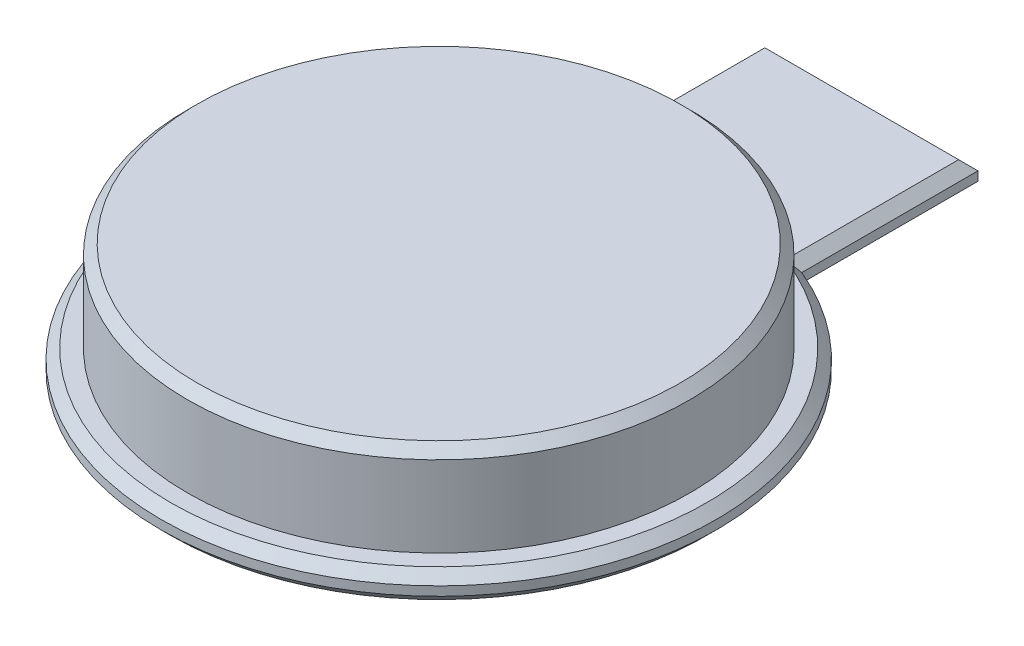
ISO-10303-21;
HEADER;
FILE_DESCRIPTION(('STEP AP214'),'2;1');
FILE_NAME('part.step','',(''),(''),'','','');
FILE_SCHEMA(('AUTOMOTIVE_DESIGN { 1 0 10303 214 1 1 1 1 }'));
ENDSEC;
DATA;
#1=APPLICATION_CONTEXT('core data for automotive mechanical design processes');
#2=APPLICATION_PROTOCOL_DEFINITION('international standard','automotive_design',2000,#1);
#3=PRODUCT_CONTEXT('',#1,'mechanical');
#4=PRODUCT('Part','Part','',(#3));
#5=PRODUCT_RELATED_PRODUCT_CATEGORY('part','',(#4));
#6=PRODUCT_DEFINITION_FORMATION('','',#4);
#7=PRODUCT_DEFINITION_CONTEXT('part definition',#1,'design');
#8=PRODUCT_DEFINITION('design','',#6,#7);
#9=PRODUCT_DEFINITION_SHAPE('','',#8);
#10=(LENGTH_UNIT() NAMED_UNIT(*) SI_UNIT(.MILLI.,.METRE.));
#11=(NAMED_UNIT(*) PLANE_ANGLE_UNIT() SI_UNIT($,.RADIAN.));
#12=(NAMED_UNIT(*) SI_UNIT($,.STERADIAN.) SOLID_ANGLE_UNIT());
#13=UNCERTAINTY_MEASURE_WITH_UNIT(LENGTH_MEASURE(1.E-05),#10,'distance_accuracy_value','');
#14=(GEOMETRIC_REPRESENTATION_CONTEXT(3) GLOBAL_UNCERTAINTY_ASSIGNED_CONTEXT((#13)) GLOBAL_UNIT_ASSIGNED_CONTEXT((#10,
#11,#12)) REPRESENTATION_CONTEXT('',''));
#15=CARTESIAN_POINT('',(0.,0.,0.));
#16=DIRECTION('',(0.,0.,1.));
#17=DIRECTION('',(1.,0.,0.));
#18=AXIS2_PLACEMENT_3D('',#15,#16,#17);
#19=CARTESIAN_POINT('',(0.,2.2,0.));
#20=DIRECTION('',(0.,-1.,0.));
#21=DIRECTION('',(0.,0.,-1.));
#22=AXIS2_PLACEMENT_3D('',#19,#20,#21);
#23=CYLINDRICAL_SURFACE('',#22,21.5);
#24=DIRECTION('',(0.,-1.,0.));
#25=VECTOR('',#24,1.);
#26=CARTESIAN_POINT('',(-8.25,2.2,-19.8541557362684));
#27=LINE('',#26,#25);
#28=CARTESIAN_POINT('',(-8.25,1.44999999999999,-19.8541557362684));
#29=VERTEX_POINT('',#28);
#30=CARTESIAN_POINT('',(-8.25,0.749999999999997,-19.8541557362684));
#31=VERTEX_POINT('',#30);
#32=EDGE_CURVE('E178',#29,#31,#27,.T.);
#33=ORIENTED_EDGE('',*,*,#32,.T.);
#34=CARTESIAN_POINT('',(0.,0.749999999999997,0.));
#35=DIRECTION('',(0.,1.,0.));
#36=DIRECTION('',(0.,0.,1.));
#37=AXIS2_PLACEMENT_3D('',#34,#35,#36);
#38=CIRCLE('',#37,21.5);
#39=CARTESIAN_POINT('',(8.25,0.749999999999997,-19.8541557362684));
#40=VERTEX_POINT('',#39);
#41=EDGE_CURVE('E213',#31,#40,#38,.T.);
#42=ORIENTED_EDGE('',*,*,#41,.T.);
#43=DIRECTION('',(0.,-1.,0.));
#44=VECTOR('',#43,1.);
#45=CARTESIAN_POINT('',(8.25,2.2,-19.8541557362684));
#46=LINE('',#45,#44);
#47=CARTESIAN_POINT('',(8.25,1.44999999999999,-19.8541557362684));
#48=VERTEX_POINT('',#47);
#49=EDGE_CURVE('E125',#48,#40,#46,.T.);
#50=ORIENTED_EDGE('',*,*,#49,.F.);
#51=CARTESIAN_POINT('',(0.,1.44999999999999,0.));
#52=DIRECTION('',(0.,1.,0.));
#53=DIRECTION('',(0.,0.,1.));
#54=AXIS2_PLACEMENT_3D('',#51,#52,#53);
#55=CIRCLE('',#54,21.5);
#56=EDGE_CURVE('E215',#48,#29,#55,.F.);
#57=ORIENTED_EDGE('',*,*,#56,.T.);
#58=EDGE_LOOP('',(#33,#42,#50,#57));
#59=FACE_BOUND('',#58,.T.);
#60=ADVANCED_FACE('F35',(#59),#23,.T.);
#61=CARTESIAN_POINT('',(8.25,2.2,-33.5));
#62=DIRECTION('',(-1.,0.,0.));
#63=DIRECTION('',(0.,0.,1.));
#64=AXIS2_PLACEMENT_3D('',#61,#62,#63);
#65=PLANE('',#64);
#66=ORIENTED_EDGE('',*,*,#49,.T.);
#67=DIRECTION('',(0.,0.,-1.));
#68=VECTOR('',#67,1.);
#69=CARTESIAN_POINT('',(8.25,0.749999999999997,-33.5));
#70=LINE('',#69,#68);
#71=CARTESIAN_POINT('',(8.25,0.749999999999997,-33.5));
#72=VERTEX_POINT('',#71);
#73=EDGE_CURVE('E124',#40,#72,#70,.T.);
#74=ORIENTED_EDGE('',*,*,#73,.T.);
#75=DIRECTION('',(0.,-1.,0.));
#76=VECTOR('',#75,1.);
#77=CARTESIAN_POINT('',(8.25,2.2,-33.5));
#78=LINE('',#77,#76);
#79=CARTESIAN_POINT('',(8.25,1.44999999999999,-33.5));
#80=VERTEX_POINT('',#79);
#81=EDGE_CURVE('E107',#80,#72,#78,.T.);
#82=ORIENTED_EDGE('',*,*,#81,.F.);
#83=DIRECTION('',(0.,0.,1.));
#84=VECTOR('',#83,1.);
#85=CARTESIAN_POINT('',(8.25,1.44999999999999,-19.8541557362684));
#86=LINE('',#85,#84);
#87=EDGE_CURVE('E121',#80,#48,#86,.T.);
#88=ORIENTED_EDGE('',*,*,#87,.T.);
#89=EDGE_LOOP('',(#66,#74,#82,#88));
#90=FACE_BOUND('',#89,.T.);
#91=ADVANCED_FACE('F120',(#90),#65,.F.);
#92=CARTESIAN_POINT('',(-8.25,2.2,-33.5));
#93=DIRECTION('',(0.,0.,1.));
#94=DIRECTION('',(1.,0.,0.));
#95=AXIS2_PLACEMENT_3D('',#92,#93,#94);
#96=PLANE('',#95);
#97=ORIENTED_EDGE('',*,*,#81,.T.);
#98=DIRECTION('',(-1.,0.,0.));
#99=VECTOR('',#98,1.);
#100=CARTESIAN_POINT('',(-8.25,0.749999999999997,-33.5));
#101=LINE('',#100,#99);
#102=CARTESIAN_POINT('',(-8.25,0.749999999999997,-33.5));
#103=VERTEX_POINT('',#102);
#104=EDGE_CURVE('E113',#72,#103,#101,.T.);
#105=ORIENTED_EDGE('',*,*,#104,.T.);
#106=DIRECTION('',(0.,-1.,0.));
#107=VECTOR('',#106,1.);
#108=CARTESIAN_POINT('',(-8.25,2.2,-33.5));
#109=LINE('',#108,#107);
#110=CARTESIAN_POINT('',(-8.25,1.44999999999999,-33.5));
#111=VERTEX_POINT('',#110);
#112=EDGE_CURVE('E109',#111,#103,#109,.T.);
#113=ORIENTED_EDGE('',*,*,#112,.F.);
#114=DIRECTION('',(1.,0.,0.));
#115=VECTOR('',#114,1.);
#116=CARTESIAN_POINT('',(8.25,1.44999999999999,-33.5));
#117=LINE('',#116,#115);
#118=EDGE_CURVE('E104',#111,#80,#117,.T.);
#119=ORIENTED_EDGE('',*,*,#118,.T.);
#120=EDGE_LOOP('',(#97,#105,#113,#119));
#121=FACE_BOUND('',#120,.T.);
#122=ADVANCED_FACE('F106',(#121),#96,.F.);
#123=CARTESIAN_POINT('',(-8.25,2.2,-19.8541557362684));
#124=DIRECTION('',(1.,0.,0.));
#125=DIRECTION('',(0.,0.,-1.));
#126=AXIS2_PLACEMENT_3D('',#123,#124,#125);
#127=PLANE('',#126);
#128=ORIENTED_EDGE('',*,*,#112,.T.);
#129=DIRECTION('',(0.,0.,1.));
#130=VECTOR('',#129,1.);
#131=CARTESIAN_POINT('',(-8.25,0.749999999999997,-19.8541557362684));
#132=LINE('',#131,#130);
#133=EDGE_CURVE('E217',#103,#31,#132,.T.);
#134=ORIENTED_EDGE('',*,*,#133,.T.);
#135=ORIENTED_EDGE('',*,*,#32,.F.);
#136=DIRECTION('',(0.,0.,-1.));
#137=VECTOR('',#136,1.);
#138=CARTESIAN_POINT('',(-8.25,1.44999999999999,-33.5));
#139=LINE('',#138,#137);
#140=EDGE_CURVE('E219',#29,#111,#139,.T.);
#141=ORIENTED_EDGE('',*,*,#140,.T.);
#142=EDGE_LOOP('',(#128,#134,#135,#141));
#143=FACE_BOUND('',#142,.T.);
#144=ADVANCED_FACE('F243',(#143),#127,.F.);
#145=CARTESIAN_POINT('',(0.,2.2,0.));
#146=DIRECTION('',(0.,1.,0.));
#147=DIRECTION('',(0.,0.,1.));
#148=AXIS2_PLACEMENT_3D('',#145,#146,#147);
#149=PLANE('',#148);
#150=DIRECTION('',(-1.,0.,0.));
#151=VECTOR('',#150,1.);
#152=CARTESIAN_POINT('',(-8.25,2.2,-32.75));
#153=LINE('',#152,#151);
#154=CARTESIAN_POINT('',(7.49999999999999,2.2,-32.75));
#155=VERTEX_POINT('',#154);
#156=CARTESIAN_POINT('',(-7.49999999999999,2.2,-32.75));
#157=VERTEX_POINT('',#156);
#158=EDGE_CURVE('E53',#155,#157,#153,.T.);
#159=ORIENTED_EDGE('',*,*,#158,.T.);
#160=DIRECTION('',(0.,0.,1.));
#161=VECTOR('',#160,1.);
#162=CARTESIAN_POINT('',(-7.49999999999999,2.2,-19.8541557362684));
#163=LINE('',#162,#161);
#164=CARTESIAN_POINT('',(-7.49999999999999,2.2,-19.3471574139458));
#165=VERTEX_POINT('',#164);
#166=EDGE_CURVE('E207',#157,#165,#163,.T.);
#167=ORIENTED_EDGE('',*,*,#166,.T.);
#168=CARTESIAN_POINT('',(0.,2.2,0.));
#169=DIRECTION('',(0.,1.,0.));
#170=DIRECTION('',(0.,0.,1.));
#171=AXIS2_PLACEMENT_3D('',#168,#169,#170);
#172=CIRCLE('',#171,20.75);
#173=CARTESIAN_POINT('',(7.49999999999999,2.2,-19.3471574139458));
#174=VERTEX_POINT('',#173);
#175=EDGE_CURVE('E211',#165,#174,#172,.T.);
#176=ORIENTED_EDGE('',*,*,#175,.T.);
#177=DIRECTION('',(0.,0.,-1.));
#178=VECTOR('',#177,1.);
#179=CARTESIAN_POINT('',(7.49999999999999,2.2,-33.5));
#180=LINE('',#179,#178);
#181=EDGE_CURVE('E58',#174,#155,#180,.T.);
#182=ORIENTED_EDGE('',*,*,#181,.T.);
#183=EDGE_LOOP('',(#159,#167,#176,#182));
#184=FACE_BOUND('',#183,.T.);
#185=CARTESIAN_POINT('',(0.,2.2,0.));
#186=DIRECTION('',(0.,1.,0.));
#187=DIRECTION('',(0.,0.,1.));
#188=AXIS2_PLACEMENT_3D('',#185,#186,#187);
#189=CIRCLE('',#188,19.45);
#190=CARTESIAN_POINT('',(0.,2.2,19.45));
#191=VERTEX_POINT('',#190);
#192=EDGE_CURVE('E133',#191,#191,#189,.T.);
#193=ORIENTED_EDGE('',*,*,#192,.F.);
#194=EDGE_LOOP('',(#193));
#195=FACE_BOUND('',#194,.T.);
#196=ADVANCED_FACE('F240',(#184,#195),#149,.T.);
#197=CARTESIAN_POINT('',(0.,0.,0.));
#198=DIRECTION('',(0.,1.,0.));
#199=DIRECTION('',(0.,0.,1.));
#200=AXIS2_PLACEMENT_3D('',#197,#198,#199);
#201=PLANE('',#200);
#202=DIRECTION('',(1.,0.,0.));
#203=VECTOR('',#202,1.);
#204=CARTESIAN_POINT('',(0.,0.,-32.75));
#205=LINE('',#204,#203);
#206=CARTESIAN_POINT('',(-7.5,0.,-32.75));
#207=VERTEX_POINT('',#206);
#208=CARTESIAN_POINT('',(7.5,0.,-32.75));
#209=VERTEX_POINT('',#208);
#210=EDGE_CURVE('E224',#207,#209,#205,.T.);
#211=ORIENTED_EDGE('',*,*,#210,.T.);
#212=DIRECTION('',(0.,0.,1.));
#213=VECTOR('',#212,1.);
#214=CARTESIAN_POINT('',(7.5,0.,0.));
#215=LINE('',#214,#213);
#216=CARTESIAN_POINT('',(7.5,0.,-19.3471574139458));
#217=VERTEX_POINT('',#216);
#218=EDGE_CURVE('E114',#209,#217,#215,.T.);
#219=ORIENTED_EDGE('',*,*,#218,.T.);
#220=CARTESIAN_POINT('',(0.,0.,0.));
#221=DIRECTION('',(0.,1.,0.));
#222=DIRECTION('',(0.,0.,1.));
#223=AXIS2_PLACEMENT_3D('',#220,#221,#222);
#224=CIRCLE('',#223,20.75);
#225=CARTESIAN_POINT('',(-7.5,0.,-19.3471574139458));
#226=VERTEX_POINT('',#225);
#227=EDGE_CURVE('E228',#217,#226,#224,.F.);
#228=ORIENTED_EDGE('',*,*,#227,.T.);
#229=DIRECTION('',(0.,0.,-1.));
#230=VECTOR('',#229,1.);
#231=CARTESIAN_POINT('',(-7.5,0.,0.));
#232=LINE('',#231,#230);
#233=EDGE_CURVE('E226',#226,#207,#232,.T.);
#234=ORIENTED_EDGE('',*,*,#233,.T.);
#235=EDGE_LOOP('',(#211,#219,#228,#234));
#236=FACE_BOUND('',#235,.T.);
#237=ADVANCED_FACE('F242',(#236),#201,.F.);
#238=CARTESIAN_POINT('',(0.,9.2,0.));
#239=DIRECTION('',(0.,-1.,0.));
#240=DIRECTION('',(0.,0.,-1.));
#241=AXIS2_PLACEMENT_3D('',#238,#239,#240);
#242=CYLINDRICAL_SURFACE('',#241,19.45);
#243=CARTESIAN_POINT('',(0.,8.45,0.));
#244=DIRECTION('',(0.,1.,0.));
#245=DIRECTION('',(0.,0.,1.));
#246=AXIS2_PLACEMENT_3D('',#243,#244,#245);
#247=CIRCLE('',#246,19.45);
#248=CARTESIAN_POINT('',(0.,8.45,19.45));
#249=VERTEX_POINT('',#248);
#250=EDGE_CURVE('E11',#249,#249,#247,.F.);
#251=ORIENTED_EDGE('',*,*,#250,.T.);
#252=EDGE_LOOP('',(#251));
#253=FACE_BOUND('',#252,.T.);
#254=ORIENTED_EDGE('',*,*,#192,.T.);
#255=EDGE_LOOP('',(#254));
#256=FACE_BOUND('',#255,.T.);
#257=ADVANCED_FACE('F238',(#253,#256),#242,.T.);
#258=CARTESIAN_POINT('',(0.,9.2,0.));
#259=DIRECTION('',(0.,1.,0.));
#260=DIRECTION('',(0.,0.,1.));
#261=AXIS2_PLACEMENT_3D('',#258,#259,#260);
#262=PLANE('',#261);
#263=CARTESIAN_POINT('',(0.,9.2,0.));
#264=DIRECTION('',(0.,1.,0.));
#265=DIRECTION('',(0.,0.,1.));
#266=AXIS2_PLACEMENT_3D('',#263,#264,#265);
#267=CIRCLE('',#266,18.7);
#268=CARTESIAN_POINT('',(0.,9.2,18.7));
#269=VERTEX_POINT('',#268);
#270=EDGE_CURVE('E45',#269,#269,#267,.T.);
#271=ORIENTED_EDGE('',*,*,#270,.T.);
#272=EDGE_LOOP('',(#271));
#273=FACE_BOUND('',#272,.T.);
#274=ADVANCED_FACE('F289',(#273),#262,.T.);
#275=CARTESIAN_POINT('',(-8.25,0.749999999999997,-19.8541557362684));
#276=DIRECTION('',(0.707106781186544,0.707106781186551,0.));
#277=DIRECTION('',(0.,0.,1.));
#278=AXIS2_PLACEMENT_3D('',#275,#276,#277);
#279=PLANE('',#278);
#280=DIRECTION('',(0.577350269189629,-0.577350269189623,0.577350269189626));
#281=VECTOR('',#280,1.);
#282=CARTESIAN_POINT('',(-3.70138524542278,-3.79861475457718,-28.9513852454228));
#283=LINE('',#282,#281);
#284=EDGE_CURVE('E179',#207,#103,#283,.F.);
#285=ORIENTED_EDGE('',*,*,#284,.F.);
#286=ORIENTED_EDGE('',*,*,#233,.F.);
#287=CARTESIAN_POINT('',(-8.25,0.749999999999997,-19.8541557362684));
#288=CARTESIAN_POINT('',(-8.12469934136371,0.624699341363706,-19.7705455924783));
#289=CARTESIAN_POINT('',(-7.99954901905289,0.499549019052893,-19.6864906651881));
#290=CARTESIAN_POINT('',(-7.74954901898531,0.24954901898531,-19.5174912246139));
#291=CARTESIAN_POINT('',(-7.62469934129612,0.124699341296124,-19.4325467111299));
#292=CARTESIAN_POINT('',(-7.5,0.,-19.3471574139459));
#293=B_SPLINE_CURVE_WITH_KNOTS('',3,(#287,#288,#289,#290,#291,#292),.UNSPECIFIED.,.F.,.F.,(4,2,
4),(0.,0.587804333394118,1.17560879891214),.UNSPECIFIED.);
#294=EDGE_CURVE('E170',#31,#226,#293,.T.);
#295=ORIENTED_EDGE('',*,*,#294,.F.);
#296=ORIENTED_EDGE('',*,*,#133,.F.);
#297=EDGE_LOOP('',(#285,#286,#295,#296));
#298=FACE_BOUND('',#297,.T.);
#299=ADVANCED_FACE('F182',(#298),#279,.F.);
#300=CARTESIAN_POINT('',(0.,0.749999999999997,0.));
#301=DIRECTION('',(0.,1.,0.));
#302=DIRECTION('',(0.,0.,1.));
#303=AXIS2_PLACEMENT_3D('',#300,#301,#302);
#304=CONICAL_SURFACE('',#303,21.5,0.785398163397453);
#305=ORIENTED_EDGE('',*,*,#294,.T.);
#306=ORIENTED_EDGE('',*,*,#227,.F.);
#307=CARTESIAN_POINT('',(7.5,0.,-19.3471574139458));
#308=CARTESIAN_POINT('',(7.62469934129612,0.124699341296124,-19.4325467111299));
#309=CARTESIAN_POINT('',(7.74954901898531,0.24954901898531,-19.5174912246139));
#310=CARTESIAN_POINT('',(7.99954901905289,0.499549019052893,-19.6864906651881));
#311=CARTESIAN_POINT('',(8.12469934136371,0.624699341363706,-19.7705455924783));
#312=CARTESIAN_POINT('',(8.25,0.749999999999997,-19.8541557362684));
#313=B_SPLINE_CURVE_WITH_KNOTS('',3,(#307,#308,#309,#310,#311,#312),.UNSPECIFIED.,.F.,.F.,(4,2,
4),(0.,0.58780446551802,1.17560879891214),.UNSPECIFIED.);
#314=EDGE_CURVE('E137',#40,#217,#313,.F.);
#315=ORIENTED_EDGE('',*,*,#314,.F.);
#316=ORIENTED_EDGE('',*,*,#41,.F.);
#317=EDGE_LOOP('',(#305,#306,#315,#316));
#318=FACE_BOUND('',#317,.T.);
#319=ADVANCED_FACE('F186',(#318),#304,.T.);
#320=CARTESIAN_POINT('',(-8.25,0.749999999999997,-33.5));
#321=DIRECTION('',(0.,0.707106781186549,0.707106781186546));
#322=DIRECTION('',(-1.,0.,0.));
#323=AXIS2_PLACEMENT_3D('',#320,#321,#322);
#324=PLANE('',#323);
#325=ORIENTED_EDGE('',*,*,#284,.T.);
#326=ORIENTED_EDGE('',*,*,#104,.F.);
#327=DIRECTION('',(-0.577350269189629,-0.577350269189623,0.577350269189626));
#328=VECTOR('',#327,1.);
#329=CARTESIAN_POINT('',(2.74999999999995,-4.75,-28.));
#330=LINE('',#329,#328);
#331=EDGE_CURVE('E136',#209,#72,#330,.F.);
#332=ORIENTED_EDGE('',*,*,#331,.F.);
#333=ORIENTED_EDGE('',*,*,#210,.F.);
#334=EDGE_LOOP('',(#325,#326,#332,#333));
#335=FACE_BOUND('',#334,.T.);
#336=ADVANCED_FACE('F194',(#335),#324,.F.);
#337=CARTESIAN_POINT('',(8.25,0.749999999999997,-33.5));
#338=DIRECTION('',(-0.707106781186544,0.707106781186551,0.));
#339=DIRECTION('',(0.,0.,-1.));
#340=AXIS2_PLACEMENT_3D('',#337,#338,#339);
#341=PLANE('',#340);
#342=ORIENTED_EDGE('',*,*,#314,.T.);
#343=ORIENTED_EDGE('',*,*,#218,.F.);
#344=ORIENTED_EDGE('',*,*,#331,.T.);
#345=ORIENTED_EDGE('',*,*,#73,.F.);
#346=EDGE_LOOP('',(#342,#343,#344,#345));
#347=FACE_BOUND('',#346,.T.);
#348=ADVANCED_FACE('F196',(#347),#341,.F.);
#349=CARTESIAN_POINT('',(7.49999999999999,2.2,0.));
#350=DIRECTION('',(0.707106781186549,0.707106781186546,0.));
#351=DIRECTION('',(0.,0.,1.));
#352=AXIS2_PLACEMENT_3D('',#349,#350,#351);
#353=PLANE('',#352);
#354=CARTESIAN_POINT('',(8.25,1.44999999999999,-19.8541557362684));
#355=CARTESIAN_POINT('',(8.12469934136371,1.57530065863628,-19.7705455924783));
#356=CARTESIAN_POINT('',(7.99954901905289,1.7004509809471,-19.6864906651881));
#357=CARTESIAN_POINT('',(7.7495490189853,1.95045098101469,-19.5174912246139));
#358=CARTESIAN_POINT('',(7.62469934129612,2.07530065870387,-19.4325467111299));
#359=CARTESIAN_POINT('',(7.49999999999999,2.2,-19.3471574139458));
#360=B_SPLINE_CURVE_WITH_KNOTS('',3,(#354,#355,#356,#357,#358,#359),.UNSPECIFIED.,.F.,.F.,(4,2,
4),(0.,0.587804333394126,1.17560879891215),.UNSPECIFIED.);
#361=EDGE_CURVE('E131',#48,#174,#360,.T.);
#362=ORIENTED_EDGE('',*,*,#361,.F.);
#363=ORIENTED_EDGE('',*,*,#87,.F.);
#364=DIRECTION('',(-0.577350269189625,0.577350269189628,0.577350269189625));
#365=VECTOR('',#364,1.);
#366=CARTESIAN_POINT('',(-3.41666666666664,13.1166666666667,-21.8333333333334));
#367=LINE('',#366,#365);
#368=EDGE_CURVE('E40',#155,#80,#367,.F.);
#369=ORIENTED_EDGE('',*,*,#368,.F.);
#370=ORIENTED_EDGE('',*,*,#181,.F.);
#371=EDGE_LOOP('',(#362,#363,#369,#370));
#372=FACE_BOUND('',#371,.T.);
#373=ADVANCED_FACE('F129',(#372),#353,.T.);
#374=CARTESIAN_POINT('',(0.,2.2,-32.75));
#375=DIRECTION('',(0.,0.707106781186546,-0.707106781186549));
#376=DIRECTION('',(1.,0.,0.));
#377=AXIS2_PLACEMENT_3D('',#374,#375,#376);
#378=PLANE('',#377);
#379=ORIENTED_EDGE('',*,*,#368,.T.);
#380=ORIENTED_EDGE('',*,*,#118,.F.);
#381=DIRECTION('',(0.577350269189625,0.577350269189628,0.577350269189625));
#382=VECTOR('',#381,1.);
#383=CARTESIAN_POINT('',(-5.,4.7,-30.25));
#384=LINE('',#383,#382);
#385=EDGE_CURVE('E139',#157,#111,#384,.F.);
#386=ORIENTED_EDGE('',*,*,#385,.F.);
#387=ORIENTED_EDGE('',*,*,#158,.F.);
#388=EDGE_LOOP('',(#379,#380,#386,#387));
#389=FACE_BOUND('',#388,.T.);
#390=ADVANCED_FACE('F135',(#389),#378,.T.);
#391=CARTESIAN_POINT('',(0.,2.2,0.));
#392=DIRECTION('',(0.,-1.,0.));
#393=DIRECTION('',(0.,0.,-1.));
#394=AXIS2_PLACEMENT_3D('',#391,#392,#393);
#395=CONICAL_SURFACE('',#394,20.75,0.785398163397446);
#396=ORIENTED_EDGE('',*,*,#361,.T.);
#397=ORIENTED_EDGE('',*,*,#175,.F.);
#398=CARTESIAN_POINT('',(-7.49999999999999,2.2,-19.3471574139458));
#399=CARTESIAN_POINT('',(-7.62469934129612,2.07530065870387,-19.4325467111299));
#400=CARTESIAN_POINT('',(-7.74954901898531,1.95045098101468,-19.5174912246139));
#401=CARTESIAN_POINT('',(-7.99954901905289,1.7004509809471,-19.6864906651881));
#402=CARTESIAN_POINT('',(-8.12469934136371,1.57530065863628,-19.7705455924783));
#403=CARTESIAN_POINT('',(-8.25,1.44999999999999,-19.8541557362684));
#404=B_SPLINE_CURVE_WITH_KNOTS('',3,(#398,#399,#400,#401,#402,#403),.UNSPECIFIED.,.F.,.F.,(4,2,
4),(0.,0.587804465518028,1.17560879891215),.UNSPECIFIED.);
#405=EDGE_CURVE('E142',#29,#165,#404,.F.);
#406=ORIENTED_EDGE('',*,*,#405,.F.);
#407=ORIENTED_EDGE('',*,*,#56,.F.);
#408=EDGE_LOOP('',(#396,#397,#406,#407));
#409=FACE_BOUND('',#408,.T.);
#410=ADVANCED_FACE('F154',(#409),#395,.T.);
#411=CARTESIAN_POINT('',(-7.49999999999999,2.2,0.));
#412=DIRECTION('',(-0.707106781186549,0.707106781186546,0.));
#413=DIRECTION('',(0.,0.,-1.));
#414=AXIS2_PLACEMENT_3D('',#411,#412,#413);
#415=PLANE('',#414);
#416=ORIENTED_EDGE('',*,*,#385,.T.);
#417=ORIENTED_EDGE('',*,*,#140,.F.);
#418=ORIENTED_EDGE('',*,*,#405,.T.);
#419=ORIENTED_EDGE('',*,*,#166,.F.);
#420=EDGE_LOOP('',(#416,#417,#418,#419));
#421=FACE_BOUND('',#420,.T.);
#422=ADVANCED_FACE('F161',(#421),#415,.T.);
#423=CARTESIAN_POINT('',(0.,9.2,0.));
#424=DIRECTION('',(0.,-1.,0.));
#425=DIRECTION('',(0.,0.,-1.));
#426=AXIS2_PLACEMENT_3D('',#423,#424,#425);
#427=CONICAL_SURFACE('',#426,18.7,0.785398163397444);
#428=ORIENTED_EDGE('',*,*,#250,.F.);
#429=EDGE_LOOP('',(#428));
#430=FACE_BOUND('',#429,.T.);
#431=ORIENTED_EDGE('',*,*,#270,.F.);
#432=EDGE_LOOP('',(#431));
#433=FACE_BOUND('',#432,.T.);
#434=ADVANCED_FACE('F38',(#430,#433),#427,.T.);
#435=CLOSED_SHELL('',(#60,#91,#122,#144,#196,#237,#257,#274,#299,#319,#336,#348,#373,#390,#410,
#422,#434));
#436=MANIFOLD_SOLID_BREP('B2',#435);
#437=ADVANCED_BREP_SHAPE_REPRESENTATION('',(#18,#436),#14);
#438=SHAPE_DEFINITION_REPRESENTATION(#9,#437);
ENDSEC;
END-ISO-10303-21;
